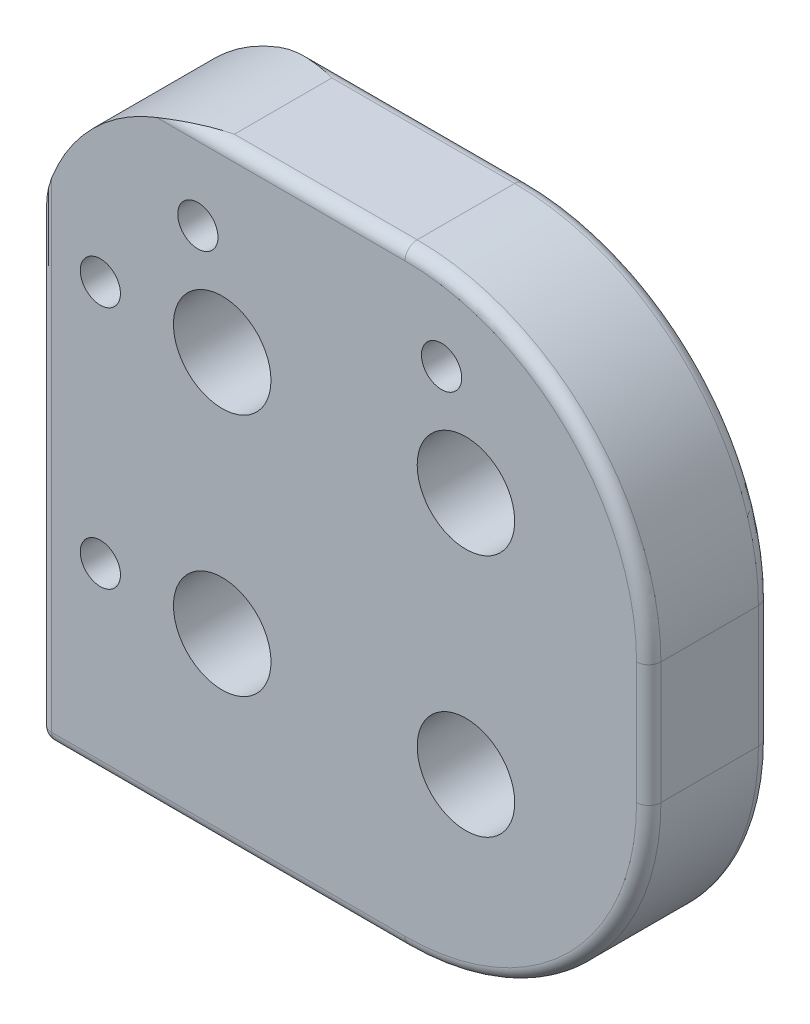
ISO-10303-21;
HEADER;
FILE_DESCRIPTION(('STEP AP214'),'2;1');
FILE_NAME('part.step','',(''),(''),'','','');
FILE_SCHEMA(('AUTOMOTIVE_DESIGN { 1 0 10303 214 1 1 1 1 }'));
ENDSEC;
DATA;
#1=APPLICATION_CONTEXT('core data for automotive mechanical design processes');
#2=APPLICATION_PROTOCOL_DEFINITION('international standard','automotive_design',2000,#1);
#3=PRODUCT_CONTEXT('',#1,'mechanical');
#4=PRODUCT('Part','Part','',(#3));
#5=PRODUCT_RELATED_PRODUCT_CATEGORY('part','',(#4));
#6=PRODUCT_DEFINITION_FORMATION('','',#4);
#7=PRODUCT_DEFINITION_CONTEXT('part definition',#1,'design');
#8=PRODUCT_DEFINITION('design','',#6,#7);
#9=PRODUCT_DEFINITION_SHAPE('','',#8);
#10=(LENGTH_UNIT() NAMED_UNIT(*) SI_UNIT(.MILLI.,.METRE.));
#11=(NAMED_UNIT(*) PLANE_ANGLE_UNIT() SI_UNIT($,.RADIAN.));
#12=(NAMED_UNIT(*) SI_UNIT($,.STERADIAN.) SOLID_ANGLE_UNIT());
#13=UNCERTAINTY_MEASURE_WITH_UNIT(LENGTH_MEASURE(1.E-05),#10,'distance_accuracy_value','');
#14=(GEOMETRIC_REPRESENTATION_CONTEXT(3) GLOBAL_UNCERTAINTY_ASSIGNED_CONTEXT((#13)) GLOBAL_UNIT_ASSIGNED_CONTEXT((#10,
#11,#12)) REPRESENTATION_CONTEXT('',''));
#15=CARTESIAN_POINT('',(0.,0.,0.));
#16=DIRECTION('',(0.,0.,1.));
#17=DIRECTION('',(1.,0.,0.));
#18=AXIS2_PLACEMENT_3D('',#15,#16,#17);
#19=CARTESIAN_POINT('',(-25.,25.,10.));
#20=DIRECTION('',(0.,-1.,0.));
#21=DIRECTION('',(0.,0.,-1.));
#22=AXIS2_PLACEMENT_3D('',#19,#20,#21);
#23=PLANE('',#22);
#24=DIRECTION('',(0.,0.,1.));
#25=VECTOR('',#24,1.);
#26=CARTESIAN_POINT('',(-9.9999999999999,25.,0.));
#27=LINE('',#26,#25);
#28=CARTESIAN_POINT('',(-9.9999999999999,25.,0.999999999999999));
#29=VERTEX_POINT('',#28);
#30=CARTESIAN_POINT('',(-9.9999999999999,25.,9.));
#31=VERTEX_POINT('',#30);
#32=EDGE_CURVE('E154',#29,#31,#27,.T.);
#33=ORIENTED_EDGE('',*,*,#32,.T.);
#34=DIRECTION('',(-1.,0.,0.));
#35=VECTOR('',#34,1.);
#36=CARTESIAN_POINT('',(-25.,25.,9.));
#37=LINE('',#36,#35);
#38=CARTESIAN_POINT('',(5.,25.,9.));
#39=VERTEX_POINT('',#38);
#40=EDGE_CURVE('E223',#31,#39,#37,.F.);
#41=ORIENTED_EDGE('',*,*,#40,.T.);
#42=DIRECTION('',(0.,0.,-1.));
#43=VECTOR('',#42,1.);
#44=CARTESIAN_POINT('',(5.,25.,10.));
#45=LINE('',#44,#43);
#46=CARTESIAN_POINT('',(5.,25.,0.999999999999999));
#47=VERTEX_POINT('',#46);
#48=EDGE_CURVE('E281',#39,#47,#45,.T.);
#49=ORIENTED_EDGE('',*,*,#48,.T.);
#50=DIRECTION('',(-1.,0.,0.));
#51=VECTOR('',#50,1.);
#52=CARTESIAN_POINT('',(-25.,25.,0.999999999999999));
#53=LINE('',#52,#51);
#54=EDGE_CURVE('E54',#47,#29,#53,.T.);
#55=ORIENTED_EDGE('',*,*,#54,.T.);
#56=EDGE_LOOP('',(#33,#41,#49,#55));
#57=FACE_BOUND('',#56,.T.);
#58=ADVANCED_FACE('F40',(#57),#23,.F.);
#59=CARTESIAN_POINT('',(0.,0.,10.));
#60=DIRECTION('',(0.,0.,-1.));
#61=DIRECTION('',(-1.,0.,0.));
#62=AXIS2_PLACEMENT_3D('',#59,#60,#61);
#63=PLANE('',#62);
#64=CARTESIAN_POINT('',(-20.,-10.,10.));
#65=DIRECTION('',(0.,0.,1.));
#66=DIRECTION('',(1.,0.,0.));
#67=AXIS2_PLACEMENT_3D('',#64,#65,#66);
#68=CIRCLE('',#67,1.65);
#69=CARTESIAN_POINT('',(-18.35,-10.,10.));
#70=VERTEX_POINT('',#69);
#71=EDGE_CURVE('E377',#70,#70,#68,.T.);
#72=ORIENTED_EDGE('',*,*,#71,.F.);
#73=EDGE_LOOP('',(#72));
#74=FACE_BOUND('',#73,.T.);
#75=CARTESIAN_POINT('',(-20.,10.,10.));
#76=DIRECTION('',(0.,0.,1.));
#77=DIRECTION('',(1.,0.,0.));
#78=AXIS2_PLACEMENT_3D('',#75,#76,#77);
#79=CIRCLE('',#78,1.65);
#80=CARTESIAN_POINT('',(-18.35,10.,10.));
#81=VERTEX_POINT('',#80);
#82=EDGE_CURVE('E380',#81,#81,#79,.T.);
#83=ORIENTED_EDGE('',*,*,#82,.F.);
#84=EDGE_LOOP('',(#83));
#85=FACE_BOUND('',#84,.T.);
#86=CARTESIAN_POINT('',(-12.,18.,10.));
#87=DIRECTION('',(0.,0.,1.));
#88=DIRECTION('',(1.,0.,0.));
#89=AXIS2_PLACEMENT_3D('',#86,#87,#88);
#90=CIRCLE('',#89,1.65);
#91=CARTESIAN_POINT('',(-10.35,18.,10.));
#92=VERTEX_POINT('',#91);
#93=EDGE_CURVE('E386',#92,#92,#90,.T.);
#94=ORIENTED_EDGE('',*,*,#93,.F.);
#95=EDGE_LOOP('',(#94));
#96=FACE_BOUND('',#95,.T.);
#97=CARTESIAN_POINT('',(8.,18.,10.));
#98=DIRECTION('',(0.,0.,1.));
#99=DIRECTION('',(1.,0.,0.));
#100=AXIS2_PLACEMENT_3D('',#97,#98,#99);
#101=CIRCLE('',#100,1.65);
#102=CARTESIAN_POINT('',(9.65,18.,10.));
#103=VERTEX_POINT('',#102);
#104=EDGE_CURVE('E392',#103,#103,#101,.T.);
#105=ORIENTED_EDGE('',*,*,#104,.F.);
#106=EDGE_LOOP('',(#105));
#107=FACE_BOUND('',#106,.T.);
#108=CARTESIAN_POINT('',(-10.,-10.,10.));
#109=DIRECTION('',(0.,0.,1.));
#110=DIRECTION('',(-1.,0.,0.));
#111=AXIS2_PLACEMENT_3D('',#108,#109,#110);
#112=CIRCLE('',#111,4.);
#113=CARTESIAN_POINT('',(-14.,-10.,10.));
#114=VERTEX_POINT('',#113);
#115=EDGE_CURVE('E409',#114,#114,#112,.T.);
#116=ORIENTED_EDGE('',*,*,#115,.F.);
#117=EDGE_LOOP('',(#116));
#118=FACE_BOUND('',#117,.T.);
#119=CARTESIAN_POINT('',(9.99999999999997,-10.,10.));
#120=DIRECTION('',(0.,0.,1.));
#121=DIRECTION('',(1.,0.,0.));
#122=AXIS2_PLACEMENT_3D('',#119,#120,#121);
#123=CIRCLE('',#122,4.);
#124=CARTESIAN_POINT('',(14.,-10.,10.));
#125=VERTEX_POINT('',#124);
#126=EDGE_CURVE('E403',#125,#125,#123,.T.);
#127=ORIENTED_EDGE('',*,*,#126,.F.);
#128=EDGE_LOOP('',(#127));
#129=FACE_BOUND('',#128,.T.);
#130=CARTESIAN_POINT('',(10.,10.,10.));
#131=DIRECTION('',(0.,0.,1.));
#132=DIRECTION('',(-1.,0.,0.));
#133=AXIS2_PLACEMENT_3D('',#130,#131,#132);
#134=CIRCLE('',#133,4.);
#135=CARTESIAN_POINT('',(6.,10.,10.));
#136=VERTEX_POINT('',#135);
#137=EDGE_CURVE('E397',#136,#136,#134,.T.);
#138=ORIENTED_EDGE('',*,*,#137,.F.);
#139=EDGE_LOOP('',(#138));
#140=FACE_BOUND('',#139,.T.);
#141=CARTESIAN_POINT('',(-10.,10.,10.));
#142=DIRECTION('',(0.,0.,1.));
#143=DIRECTION('',(1.,0.,0.));
#144=AXIS2_PLACEMENT_3D('',#141,#142,#143);
#145=CIRCLE('',#144,4.);
#146=CARTESIAN_POINT('',(-6.,10.,10.));
#147=VERTEX_POINT('',#146);
#148=EDGE_CURVE('E276',#147,#147,#145,.T.);
#149=ORIENTED_EDGE('',*,*,#148,.F.);
#150=EDGE_LOOP('',(#149));
#151=FACE_BOUND('',#150,.T.);
#152=DIRECTION('',(-1.,0.,0.));
#153=VECTOR('',#152,1.);
#154=CARTESIAN_POINT('',(0.,24.,10.));
#155=LINE('',#154,#153);
#156=CARTESIAN_POINT('',(5.,24.,10.));
#157=VERTEX_POINT('',#156);
#158=CARTESIAN_POINT('',(-15.3851648071345,24.,10.));
#159=VERTEX_POINT('',#158);
#160=EDGE_CURVE('E206',#157,#159,#155,.T.);
#161=ORIENTED_EDGE('',*,*,#160,.T.);
#162=CARTESIAN_POINT('',(-10.,10.,10.));
#163=DIRECTION('',(0.,0.,-1.));
#164=DIRECTION('',(1.,0.,0.));
#165=AXIS2_PLACEMENT_3D('',#162,#163,#164);
#166=CIRCLE('',#165,15.);
#167=CARTESIAN_POINT('',(-24.,15.3851648071345,10.));
#168=VERTEX_POINT('',#167);
#169=EDGE_CURVE('E170',#168,#159,#166,.T.);
#170=ORIENTED_EDGE('',*,*,#169,.F.);
#171=DIRECTION('',(0.,-1.,0.));
#172=VECTOR('',#171,1.);
#173=CARTESIAN_POINT('',(-24.,0.,10.));
#174=LINE('',#173,#172);
#175=CARTESIAN_POINT('',(-24.,-24.,10.));
#176=VERTEX_POINT('',#175);
#177=EDGE_CURVE('E204',#168,#176,#174,.T.);
#178=ORIENTED_EDGE('',*,*,#177,.T.);
#179=DIRECTION('',(1.,0.,0.));
#180=VECTOR('',#179,1.);
#181=CARTESIAN_POINT('',(0.,-24.,10.));
#182=LINE('',#181,#180);
#183=CARTESIAN_POINT('',(5.,-24.,10.));
#184=VERTEX_POINT('',#183);
#185=EDGE_CURVE('E215',#176,#184,#182,.T.);
#186=ORIENTED_EDGE('',*,*,#185,.T.);
#187=CARTESIAN_POINT('',(5.,-5.,10.));
#188=DIRECTION('',(0.,0.,-1.));
#189=DIRECTION('',(-1.,0.,0.));
#190=AXIS2_PLACEMENT_3D('',#187,#188,#189);
#191=CIRCLE('',#190,19.);
#192=CARTESIAN_POINT('',(24.,-5.,10.));
#193=VERTEX_POINT('',#192);
#194=EDGE_CURVE('E213',#184,#193,#191,.F.);
#195=ORIENTED_EDGE('',*,*,#194,.T.);
#196=DIRECTION('',(0.,1.,0.));
#197=VECTOR('',#196,1.);
#198=CARTESIAN_POINT('',(24.,0.,10.));
#199=LINE('',#198,#197);
#200=CARTESIAN_POINT('',(24.,5.,10.));
#201=VERTEX_POINT('',#200);
#202=EDGE_CURVE('E211',#193,#201,#199,.T.);
#203=ORIENTED_EDGE('',*,*,#202,.T.);
#204=CARTESIAN_POINT('',(5.,5.,10.));
#205=DIRECTION('',(0.,0.,-1.));
#206=DIRECTION('',(-1.,0.,0.));
#207=AXIS2_PLACEMENT_3D('',#204,#205,#206);
#208=CIRCLE('',#207,19.);
#209=EDGE_CURVE('E209',#201,#157,#208,.F.);
#210=ORIENTED_EDGE('',*,*,#209,.T.);
#211=EDGE_LOOP('',(#161,#170,#178,#186,#195,#203,#210));
#212=FACE_BOUND('',#211,.T.);
#213=ADVANCED_FACE('F323',(#74,#85,#96,#107,#118,#129,#140,#151,#212),#63,.F.);
#214=CARTESIAN_POINT('',(0.,0.,0.));
#215=DIRECTION('',(0.,0.,-1.));
#216=DIRECTION('',(-1.,0.,0.));
#217=AXIS2_PLACEMENT_3D('',#214,#215,#216);
#218=PLANE('',#217);
#219=CARTESIAN_POINT('',(-10.,10.,0.));
#220=DIRECTION('',(0.,0.,1.));
#221=DIRECTION('',(1.,0.,0.));
#222=AXIS2_PLACEMENT_3D('',#219,#220,#221);
#223=CIRCLE('',#222,4.);
#224=CARTESIAN_POINT('',(-6.,10.,0.));
#225=VERTEX_POINT('',#224);
#226=EDGE_CURVE('E229',#225,#225,#223,.T.);
#227=ORIENTED_EDGE('',*,*,#226,.T.);
#228=EDGE_LOOP('',(#227));
#229=FACE_BOUND('',#228,.T.);
#230=CARTESIAN_POINT('',(10.,10.,0.));
#231=DIRECTION('',(0.,0.,1.));
#232=DIRECTION('',(-1.,0.,0.));
#233=AXIS2_PLACEMENT_3D('',#230,#231,#232);
#234=CIRCLE('',#233,4.);
#235=CARTESIAN_POINT('',(6.,10.,0.));
#236=VERTEX_POINT('',#235);
#237=EDGE_CURVE('E400',#236,#236,#234,.T.);
#238=ORIENTED_EDGE('',*,*,#237,.T.);
#239=EDGE_LOOP('',(#238));
#240=FACE_BOUND('',#239,.T.);
#241=CARTESIAN_POINT('',(9.99999999999997,-10.,0.));
#242=DIRECTION('',(0.,0.,1.));
#243=DIRECTION('',(1.,0.,0.));
#244=AXIS2_PLACEMENT_3D('',#241,#242,#243);
#245=CIRCLE('',#244,4.);
#246=CARTESIAN_POINT('',(14.,-10.,0.));
#247=VERTEX_POINT('',#246);
#248=EDGE_CURVE('E406',#247,#247,#245,.T.);
#249=ORIENTED_EDGE('',*,*,#248,.T.);
#250=EDGE_LOOP('',(#249));
#251=FACE_BOUND('',#250,.T.);
#252=CARTESIAN_POINT('',(-10.,-10.,0.));
#253=DIRECTION('',(0.,0.,1.));
#254=DIRECTION('',(-1.,0.,0.));
#255=AXIS2_PLACEMENT_3D('',#252,#253,#254);
#256=CIRCLE('',#255,4.);
#257=CARTESIAN_POINT('',(-14.,-10.,0.));
#258=VERTEX_POINT('',#257);
#259=EDGE_CURVE('E376',#258,#258,#256,.T.);
#260=ORIENTED_EDGE('',*,*,#259,.T.);
#261=EDGE_LOOP('',(#260));
#262=FACE_BOUND('',#261,.T.);
#263=CARTESIAN_POINT('',(8.,18.,0.));
#264=DIRECTION('',(0.,0.,1.));
#265=DIRECTION('',(1.,0.,0.));
#266=AXIS2_PLACEMENT_3D('',#263,#264,#265);
#267=CIRCLE('',#266,1.65);
#268=CARTESIAN_POINT('',(9.65,18.,0.));
#269=VERTEX_POINT('',#268);
#270=EDGE_CURVE('E372',#269,#269,#267,.T.);
#271=ORIENTED_EDGE('',*,*,#270,.T.);
#272=EDGE_LOOP('',(#271));
#273=FACE_BOUND('',#272,.T.);
#274=CARTESIAN_POINT('',(-12.,18.,0.));
#275=DIRECTION('',(0.,0.,1.));
#276=DIRECTION('',(1.,0.,0.));
#277=AXIS2_PLACEMENT_3D('',#274,#275,#276);
#278=CIRCLE('',#277,1.65);
#279=CARTESIAN_POINT('',(-10.35,18.,0.));
#280=VERTEX_POINT('',#279);
#281=EDGE_CURVE('E389',#280,#280,#278,.T.);
#282=ORIENTED_EDGE('',*,*,#281,.T.);
#283=EDGE_LOOP('',(#282));
#284=FACE_BOUND('',#283,.T.);
#285=CARTESIAN_POINT('',(-20.,10.,0.));
#286=DIRECTION('',(0.,0.,1.));
#287=DIRECTION('',(1.,0.,0.));
#288=AXIS2_PLACEMENT_3D('',#285,#286,#287);
#289=CIRCLE('',#288,1.65);
#290=CARTESIAN_POINT('',(-18.35,10.,0.));
#291=VERTEX_POINT('',#290);
#292=EDGE_CURVE('E383',#291,#291,#289,.T.);
#293=ORIENTED_EDGE('',*,*,#292,.T.);
#294=EDGE_LOOP('',(#293));
#295=FACE_BOUND('',#294,.T.);
#296=CARTESIAN_POINT('',(-20.,-10.,0.));
#297=DIRECTION('',(0.,0.,1.));
#298=DIRECTION('',(1.,0.,0.));
#299=AXIS2_PLACEMENT_3D('',#296,#297,#298);
#300=CIRCLE('',#299,1.65);
#301=CARTESIAN_POINT('',(-18.35,-10.,0.));
#302=VERTEX_POINT('',#301);
#303=EDGE_CURVE('E373',#302,#302,#300,.T.);
#304=ORIENTED_EDGE('',*,*,#303,.T.);
#305=EDGE_LOOP('',(#304));
#306=FACE_BOUND('',#305,.T.);
#307=CARTESIAN_POINT('',(-10.,10.,0.));
#308=DIRECTION('',(0.,0.,-1.));
#309=DIRECTION('',(1.,0.,0.));
#310=AXIS2_PLACEMENT_3D('',#307,#308,#309);
#311=CIRCLE('',#310,15.);
#312=CARTESIAN_POINT('',(-24.,15.3851648071345,0.));
#313=VERTEX_POINT('',#312);
#314=CARTESIAN_POINT('',(-15.3851648071345,24.,0.));
#315=VERTEX_POINT('',#314);
#316=EDGE_CURVE('E60',#313,#315,#311,.T.);
#317=ORIENTED_EDGE('',*,*,#316,.T.);
#318=DIRECTION('',(-1.,0.,0.));
#319=VECTOR('',#318,1.);
#320=CARTESIAN_POINT('',(5.,24.,0.));
#321=LINE('',#320,#319);
#322=CARTESIAN_POINT('',(5.,24.,0.));
#323=VERTEX_POINT('',#322);
#324=EDGE_CURVE('E165',#315,#323,#321,.F.);
#325=ORIENTED_EDGE('',*,*,#324,.T.);
#326=CARTESIAN_POINT('',(5.,5.,0.));
#327=DIRECTION('',(0.,0.,-1.));
#328=DIRECTION('',(-1.,0.,0.));
#329=AXIS2_PLACEMENT_3D('',#326,#327,#328);
#330=CIRCLE('',#329,19.);
#331=CARTESIAN_POINT('',(24.,5.,0.));
#332=VERTEX_POINT('',#331);
#333=EDGE_CURVE('E178',#323,#332,#330,.T.);
#334=ORIENTED_EDGE('',*,*,#333,.T.);
#335=DIRECTION('',(0.,1.,0.));
#336=VECTOR('',#335,1.);
#337=CARTESIAN_POINT('',(24.,-5.,0.));
#338=LINE('',#337,#336);
#339=CARTESIAN_POINT('',(24.,-5.,0.));
#340=VERTEX_POINT('',#339);
#341=EDGE_CURVE('E186',#332,#340,#338,.F.);
#342=ORIENTED_EDGE('',*,*,#341,.T.);
#343=CARTESIAN_POINT('',(5.,-5.,0.));
#344=DIRECTION('',(0.,0.,-1.));
#345=DIRECTION('',(-1.,0.,0.));
#346=AXIS2_PLACEMENT_3D('',#343,#344,#345);
#347=CIRCLE('',#346,19.);
#348=CARTESIAN_POINT('',(5.,-24.,0.));
#349=VERTEX_POINT('',#348);
#350=EDGE_CURVE('E188',#340,#349,#347,.T.);
#351=ORIENTED_EDGE('',*,*,#350,.T.);
#352=DIRECTION('',(1.,0.,0.));
#353=VECTOR('',#352,1.);
#354=CARTESIAN_POINT('',(-25.,-24.,0.));
#355=LINE('',#354,#353);
#356=CARTESIAN_POINT('',(-24.,-24.,0.));
#357=VERTEX_POINT('',#356);
#358=EDGE_CURVE('E190',#349,#357,#355,.F.);
#359=ORIENTED_EDGE('',*,*,#358,.T.);
#360=DIRECTION('',(0.,-1.,0.));
#361=VECTOR('',#360,1.);
#362=CARTESIAN_POINT('',(-24.,25.,0.));
#363=LINE('',#362,#361);
#364=EDGE_CURVE('E169',#357,#313,#363,.F.);
#365=ORIENTED_EDGE('',*,*,#364,.T.);
#366=EDGE_LOOP('',(#317,#325,#334,#342,#351,#359,#365));
#367=FACE_BOUND('',#366,.T.);
#368=ADVANCED_FACE('F164',(#229,#240,#251,#262,#273,#284,#295,#306,#367),#218,.T.);
#369=CARTESIAN_POINT('',(25.,-25.,10.));
#370=DIRECTION('',(-1.,0.,0.));
#371=DIRECTION('',(0.,0.,1.));
#372=AXIS2_PLACEMENT_3D('',#369,#370,#371);
#373=PLANE('',#372);
#374=DIRECTION('',(0.,0.,-1.));
#375=VECTOR('',#374,1.);
#376=CARTESIAN_POINT('',(25.,-5.,10.));
#377=LINE('',#376,#375);
#378=CARTESIAN_POINT('',(25.,-5.,9.));
#379=VERTEX_POINT('',#378);
#380=CARTESIAN_POINT('',(25.,-5.,0.999999999999999));
#381=VERTEX_POINT('',#380);
#382=EDGE_CURVE('E267',#379,#381,#377,.T.);
#383=ORIENTED_EDGE('',*,*,#382,.T.);
#384=DIRECTION('',(0.,1.,0.));
#385=VECTOR('',#384,1.);
#386=CARTESIAN_POINT('',(25.,5.,0.999999999999999));
#387=LINE('',#386,#385);
#388=CARTESIAN_POINT('',(25.,5.,0.999999999999999));
#389=VERTEX_POINT('',#388);
#390=EDGE_CURVE('E198',#381,#389,#387,.T.);
#391=ORIENTED_EDGE('',*,*,#390,.T.);
#392=DIRECTION('',(0.,0.,-1.));
#393=VECTOR('',#392,1.);
#394=CARTESIAN_POINT('',(25.,5.,10.));
#395=LINE('',#394,#393);
#396=CARTESIAN_POINT('',(25.,5.,9.));
#397=VERTEX_POINT('',#396);
#398=EDGE_CURVE('E261',#389,#397,#395,.F.);
#399=ORIENTED_EDGE('',*,*,#398,.T.);
#400=DIRECTION('',(0.,1.,0.));
#401=VECTOR('',#400,1.);
#402=CARTESIAN_POINT('',(25.,-25.,9.));
#403=LINE('',#402,#401);
#404=EDGE_CURVE('E196',#397,#379,#403,.F.);
#405=ORIENTED_EDGE('',*,*,#404,.T.);
#406=EDGE_LOOP('',(#383,#391,#399,#405));
#407=FACE_BOUND('',#406,.T.);
#408=ADVANCED_FACE('F428',(#407),#373,.F.);
#409=CARTESIAN_POINT('',(-25.,-25.,10.));
#410=DIRECTION('',(1.,0.,0.));
#411=DIRECTION('',(0.,0.,-1.));
#412=AXIS2_PLACEMENT_3D('',#409,#410,#411);
#413=PLANE('',#412);
#414=DIRECTION('',(0.,-1.,0.));
#415=VECTOR('',#414,1.);
#416=CARTESIAN_POINT('',(-25.,-25.,9.));
#417=LINE('',#416,#415);
#418=CARTESIAN_POINT('',(-25.,-24.,9.));
#419=VERTEX_POINT('',#418);
#420=CARTESIAN_POINT('',(-25.,9.9999999999999,9.));
#421=VERTEX_POINT('',#420);
#422=EDGE_CURVE('E218',#419,#421,#417,.F.);
#423=ORIENTED_EDGE('',*,*,#422,.T.);
#424=DIRECTION('',(0.,0.,1.));
#425=VECTOR('',#424,1.);
#426=CARTESIAN_POINT('',(-25.,9.9999999999999,0.));
#427=LINE('',#426,#425);
#428=CARTESIAN_POINT('',(-25.,9.9999999999999,0.999999999999999));
#429=VERTEX_POINT('',#428);
#430=EDGE_CURVE('E160',#429,#421,#427,.T.);
#431=ORIENTED_EDGE('',*,*,#430,.F.);
#432=DIRECTION('',(0.,-1.,0.));
#433=VECTOR('',#432,1.);
#434=CARTESIAN_POINT('',(-25.,-25.,0.999999999999999));
#435=LINE('',#434,#433);
#436=CARTESIAN_POINT('',(-25.,-24.,0.999999999999999));
#437=VERTEX_POINT('',#436);
#438=EDGE_CURVE('E68',#429,#437,#435,.T.);
#439=ORIENTED_EDGE('',*,*,#438,.T.);
#440=DIRECTION('',(0.,0.,-1.));
#441=VECTOR('',#440,1.);
#442=CARTESIAN_POINT('',(-25.,-24.,10.));
#443=LINE('',#442,#441);
#444=EDGE_CURVE('E221',#437,#419,#443,.F.);
#445=ORIENTED_EDGE('',*,*,#444,.T.);
#446=EDGE_LOOP('',(#423,#431,#439,#445));
#447=FACE_BOUND('',#446,.T.);
#448=ADVANCED_FACE('F331',(#447),#413,.F.);
#449=CARTESIAN_POINT('',(-25.,-25.,10.));
#450=DIRECTION('',(0.,1.,0.));
#451=DIRECTION('',(0.,0.,1.));
#452=AXIS2_PLACEMENT_3D('',#449,#450,#451);
#453=PLANE('',#452);
#454=DIRECTION('',(0.,0.,-1.));
#455=VECTOR('',#454,1.);
#456=CARTESIAN_POINT('',(-24.,-25.,10.));
#457=LINE('',#456,#455);
#458=CARTESIAN_POINT('',(-24.,-25.,9.));
#459=VERTEX_POINT('',#458);
#460=CARTESIAN_POINT('',(-24.,-25.,0.999999999999999));
#461=VERTEX_POINT('',#460);
#462=EDGE_CURVE('E284',#459,#461,#457,.T.);
#463=ORIENTED_EDGE('',*,*,#462,.T.);
#464=DIRECTION('',(1.,0.,0.));
#465=VECTOR('',#464,1.);
#466=CARTESIAN_POINT('',(5.,-25.,0.999999999999999));
#467=LINE('',#466,#465);
#468=CARTESIAN_POINT('',(5.,-25.,0.999999999999999));
#469=VERTEX_POINT('',#468);
#470=EDGE_CURVE('E176',#461,#469,#467,.T.);
#471=ORIENTED_EDGE('',*,*,#470,.T.);
#472=DIRECTION('',(0.,0.,-1.));
#473=VECTOR('',#472,1.);
#474=CARTESIAN_POINT('',(5.,-25.,10.));
#475=LINE('',#474,#473);
#476=CARTESIAN_POINT('',(5.,-25.,9.));
#477=VERTEX_POINT('',#476);
#478=EDGE_CURVE('E273',#469,#477,#475,.F.);
#479=ORIENTED_EDGE('',*,*,#478,.T.);
#480=DIRECTION('',(1.,0.,0.));
#481=VECTOR('',#480,1.);
#482=CARTESIAN_POINT('',(-25.,-25.,9.));
#483=LINE('',#482,#481);
#484=EDGE_CURVE('E181',#477,#459,#483,.F.);
#485=ORIENTED_EDGE('',*,*,#484,.T.);
#486=EDGE_LOOP('',(#463,#471,#479,#485));
#487=FACE_BOUND('',#486,.T.);
#488=ADVANCED_FACE('F288',(#487),#453,.F.);
#489=CARTESIAN_POINT('',(5.,-5.,10.));
#490=DIRECTION('',(0.,0.,-1.));
#491=DIRECTION('',(-1.,0.,0.));
#492=AXIS2_PLACEMENT_3D('',#489,#490,#491);
#493=CYLINDRICAL_SURFACE('',#492,20.);
#494=ORIENTED_EDGE('',*,*,#478,.F.);
#495=CARTESIAN_POINT('',(5.,-5.,0.999999999999999));
#496=DIRECTION('',(0.,0.,-1.));
#497=DIRECTION('',(-1.,0.,0.));
#498=AXIS2_PLACEMENT_3D('',#495,#496,#497);
#499=CIRCLE('',#498,20.);
#500=EDGE_CURVE('E194',#469,#381,#499,.F.);
#501=ORIENTED_EDGE('',*,*,#500,.T.);
#502=ORIENTED_EDGE('',*,*,#382,.F.);
#503=CARTESIAN_POINT('',(5.,-5.,9.));
#504=DIRECTION('',(0.,0.,-1.));
#505=DIRECTION('',(-1.,0.,0.));
#506=AXIS2_PLACEMENT_3D('',#503,#504,#505);
#507=CIRCLE('',#506,20.);
#508=EDGE_CURVE('E192',#379,#477,#507,.T.);
#509=ORIENTED_EDGE('',*,*,#508,.T.);
#510=EDGE_LOOP('',(#494,#501,#502,#509));
#511=FACE_BOUND('',#510,.T.);
#512=ADVANCED_FACE('F314',(#511),#493,.T.);
#513=CARTESIAN_POINT('',(5.,5.,10.));
#514=DIRECTION('',(0.,0.,-1.));
#515=DIRECTION('',(-1.,0.,0.));
#516=AXIS2_PLACEMENT_3D('',#513,#514,#515);
#517=CYLINDRICAL_SURFACE('',#516,20.);
#518=ORIENTED_EDGE('',*,*,#398,.F.);
#519=CARTESIAN_POINT('',(5.,5.,0.999999999999999));
#520=DIRECTION('',(0.,0.,-1.));
#521=DIRECTION('',(-1.,0.,0.));
#522=AXIS2_PLACEMENT_3D('',#519,#520,#521);
#523=CIRCLE('',#522,20.);
#524=EDGE_CURVE('E202',#389,#47,#523,.F.);
#525=ORIENTED_EDGE('',*,*,#524,.T.);
#526=ORIENTED_EDGE('',*,*,#48,.F.);
#527=CARTESIAN_POINT('',(5.,5.,9.));
#528=DIRECTION('',(0.,0.,-1.));
#529=DIRECTION('',(-1.,0.,0.));
#530=AXIS2_PLACEMENT_3D('',#527,#528,#529);
#531=CIRCLE('',#530,20.);
#532=EDGE_CURVE('E200',#39,#397,#531,.T.);
#533=ORIENTED_EDGE('',*,*,#532,.T.);
#534=EDGE_LOOP('',(#518,#525,#526,#533));
#535=FACE_BOUND('',#534,.T.);
#536=ADVANCED_FACE('F445',(#535),#517,.T.);
#537=CARTESIAN_POINT('',(5.,5.,9.));
#538=DIRECTION('',(0.,0.,-1.));
#539=DIRECTION('',(-1.,0.,0.));
#540=AXIS2_PLACEMENT_3D('',#537,#538,#539);
#541=TOROIDAL_SURFACE('',#540,19.,1.);
#542=CARTESIAN_POINT('',(24.,5.,9.));
#543=DIRECTION('',(0.,-1.,0.));
#544=DIRECTION('',(0.,0.,-1.));
#545=AXIS2_PLACEMENT_3D('',#542,#543,#544);
#546=CIRCLE('',#545,1.);
#547=EDGE_CURVE('E257',#397,#201,#546,.T.);
#548=ORIENTED_EDGE('',*,*,#547,.F.);
#549=ORIENTED_EDGE('',*,*,#532,.F.);
#550=CARTESIAN_POINT('',(5.,24.,9.));
#551=DIRECTION('',(-1.,0.,0.));
#552=DIRECTION('',(0.,0.,1.));
#553=AXIS2_PLACEMENT_3D('',#550,#551,#552);
#554=CIRCLE('',#553,1.);
#555=EDGE_CURVE('E259',#157,#39,#554,.T.);
#556=ORIENTED_EDGE('',*,*,#555,.F.);
#557=ORIENTED_EDGE('',*,*,#209,.F.);
#558=EDGE_LOOP('',(#548,#549,#556,#557));
#559=FACE_BOUND('',#558,.T.);
#560=ADVANCED_FACE('F42',(#559),#541,.T.);
#561=CARTESIAN_POINT('',(0.,24.,9.));
#562=DIRECTION('',(-1.,0.,0.));
#563=DIRECTION('',(0.,0.,1.));
#564=AXIS2_PLACEMENT_3D('',#561,#562,#563);
#565=CYLINDRICAL_SURFACE('',#564,1.);
#566=CARTESIAN_POINT('',(-15.3851648071345,24.,10.));
#567=CARTESIAN_POINT('',(-15.3065422189825,24.0302430802318,9.99999177096745));
#568=CARTESIAN_POINT('',(-15.2276768866572,24.0598181119397,9.99862906596334));
#569=CARTESIAN_POINT('',(-15.0695439051183,24.11760625522,9.9934855373577));
#570=CARTESIAN_POINT('',(-14.9902763408182,24.1458196420226,9.98970520465314));
#571=CARTESIAN_POINT('',(-14.7521204782051,24.2283365110435,9.97518349972585));
#572=CARTESIAN_POINT('',(-14.5927070353457,24.2805828241023,9.96126012910934));
#573=CARTESIAN_POINT('',(-14.2732438090192,24.3794052377435,9.92670591362936));
#574=CARTESIAN_POINT('',(-14.113195969466,24.4259926132005,9.90608871709156));
#575=CARTESIAN_POINT('',(-13.7923320100308,24.513645037829,9.85943700721909));
#576=CARTESIAN_POINT('',(-13.6315156257445,24.5547080198089,9.8334004752361));
#577=CARTESIAN_POINT('',(-13.1851959033455,24.6608478538277,9.75523964570049));
#578=CARTESIAN_POINT('',(-12.8990866025697,24.7200516163468,9.69847109064909));
#579=CARTESIAN_POINT('',(-12.3258642821095,24.821442731461,9.57581112777124));
#580=CARTESIAN_POINT('',(-12.0387509838522,24.8636249079946,9.50991695312218));
#581=CARTESIAN_POINT('',(-11.1762617528269,24.965008650281,9.30370088613476));
#582=CARTESIAN_POINT('',(-10.5996368749405,24.9990708898523,9.15482547152845));
#583=CARTESIAN_POINT('',(-10.015811257713,24.9999937467765,9.00408242345646));
#584=CARTESIAN_POINT('',(-10.007905559357,24.9999999964638,9.0020411803908));
#585=CARTESIAN_POINT('',(-10.,25.,9.));
#586=B_SPLINE_CURVE_WITH_KNOTS('',3,(#566,#567,#568,#569,#570,#571,#572,#573,#574,#575,#576,
#577,#578,#579,#580,#581,#582,#583,#584,#585),.UNSPECIFIED.,.F.,.F.,(4,2,2,2,2,2,2,2,2,4),(0.,
0.252681034636756,0.5053107789156,1.01001851160234,1.51370356972859,2.01757658234548,
2.90965687276398,3.8020082301165,5.58640000629381,5.61089491089817),.UNSPECIFIED.);
#587=EDGE_CURVE('E366',#159,#31,#586,.T.);
#588=ORIENTED_EDGE('',*,*,#587,.F.);
#589=ORIENTED_EDGE('',*,*,#160,.F.);
#590=ORIENTED_EDGE('',*,*,#555,.T.);
#591=ORIENTED_EDGE('',*,*,#40,.F.);
#592=EDGE_LOOP('',(#588,#589,#590,#591));
#593=FACE_BOUND('',#592,.T.);
#594=ADVANCED_FACE('F362',(#593),#565,.T.);
#595=CARTESIAN_POINT('',(24.,0.,9.));
#596=DIRECTION('',(0.,1.,0.));
#597=DIRECTION('',(0.,0.,1.));
#598=AXIS2_PLACEMENT_3D('',#595,#596,#597);
#599=CYLINDRICAL_SURFACE('',#598,1.);
#600=ORIENTED_EDGE('',*,*,#547,.T.);
#601=ORIENTED_EDGE('',*,*,#202,.F.);
#602=CARTESIAN_POINT('',(24.,-5.,9.));
#603=DIRECTION('',(0.,-1.,0.));
#604=DIRECTION('',(0.,0.,-1.));
#605=AXIS2_PLACEMENT_3D('',#602,#603,#604);
#606=CIRCLE('',#605,1.);
#607=EDGE_CURVE('E254',#379,#193,#606,.T.);
#608=ORIENTED_EDGE('',*,*,#607,.F.);
#609=ORIENTED_EDGE('',*,*,#404,.F.);
#610=EDGE_LOOP('',(#600,#601,#608,#609));
#611=FACE_BOUND('',#610,.T.);
#612=ADVANCED_FACE('F360',(#611),#599,.T.);
#613=CARTESIAN_POINT('',(5.,-5.,9.));
#614=DIRECTION('',(0.,0.,-1.));
#615=DIRECTION('',(-1.,0.,0.));
#616=AXIS2_PLACEMENT_3D('',#613,#614,#615);
#617=TOROIDAL_SURFACE('',#616,19.,1.);
#618=ORIENTED_EDGE('',*,*,#607,.T.);
#619=ORIENTED_EDGE('',*,*,#194,.F.);
#620=CARTESIAN_POINT('',(5.,-24.,9.));
#621=DIRECTION('',(-1.,0.,0.));
#622=DIRECTION('',(0.,0.,1.));
#623=AXIS2_PLACEMENT_3D('',#620,#621,#622);
#624=CIRCLE('',#623,1.);
#625=EDGE_CURVE('E252',#477,#184,#624,.T.);
#626=ORIENTED_EDGE('',*,*,#625,.F.);
#627=ORIENTED_EDGE('',*,*,#508,.F.);
#628=EDGE_LOOP('',(#618,#619,#626,#627));
#629=FACE_BOUND('',#628,.T.);
#630=ADVANCED_FACE('F319',(#629),#617,.T.);
#631=CARTESIAN_POINT('',(-24.,0.,9.));
#632=DIRECTION('',(0.,-1.,0.));
#633=DIRECTION('',(0.,0.,-1.));
#634=AXIS2_PLACEMENT_3D('',#631,#632,#633);
#635=CYLINDRICAL_SURFACE('',#634,1.);
#636=CARTESIAN_POINT('',(-24.,15.3851648071345,10.));
#637=CARTESIAN_POINT('',(-24.0302430802318,15.3065422189825,9.99999177096745));
#638=CARTESIAN_POINT('',(-24.0598181119397,15.2276768866572,9.99862906596334));
#639=CARTESIAN_POINT('',(-24.11760625522,15.0695439051183,9.9934855373577));
#640=CARTESIAN_POINT('',(-24.1458196420226,14.9902763408182,9.98970520465314));
#641=CARTESIAN_POINT('',(-24.2283365110435,14.7521204782051,9.97518349972585));
#642=CARTESIAN_POINT('',(-24.2805828241023,14.5927070353457,9.96126012910934));
#643=CARTESIAN_POINT('',(-24.3794052377435,14.2732438090192,9.92670591362936));
#644=CARTESIAN_POINT('',(-24.4259926132005,14.113195969466,9.90608871709156));
#645=CARTESIAN_POINT('',(-24.513645037829,13.7923320100308,9.85943700721909));
#646=CARTESIAN_POINT('',(-24.5547080198089,13.6315156257445,9.8334004752361));
#647=CARTESIAN_POINT('',(-24.6608478538277,13.1851959033455,9.75523964570049));
#648=CARTESIAN_POINT('',(-24.7200516163468,12.8990866025697,9.69847109064909));
#649=CARTESIAN_POINT('',(-24.821442731461,12.3258642821095,9.57581112777124));
#650=CARTESIAN_POINT('',(-24.8636249079946,12.0387509838522,9.50991695312218));
#651=CARTESIAN_POINT('',(-24.965008650281,11.1762617528269,9.30370088613476));
#652=CARTESIAN_POINT('',(-24.9990708898523,10.5996368749405,9.15482547152845));
#653=CARTESIAN_POINT('',(-24.9999937467765,10.015811257713,9.00408242345646));
#654=CARTESIAN_POINT('',(-24.9999999964638,10.007905559357,9.0020411803908));
#655=CARTESIAN_POINT('',(-25.,10.,9.));
#656=B_SPLINE_CURVE_WITH_KNOTS('',3,(#636,#637,#638,#639,#640,#641,#642,#643,#644,#645,#646,
#647,#648,#649,#650,#651,#652,#653,#654,#655),.UNSPECIFIED.,.F.,.F.,(4,2,2,2,2,2,2,2,2,4),(0.,
0.252681034636756,0.5053107789156,1.01001851160234,1.51370356972859,2.01757658234548,
2.90965687276398,3.8020082301165,5.58640000629381,5.61089491089817),.UNSPECIFIED.);
#657=EDGE_CURVE('E159',#421,#168,#656,.F.);
#658=ORIENTED_EDGE('',*,*,#657,.F.);
#659=ORIENTED_EDGE('',*,*,#422,.F.);
#660=CARTESIAN_POINT('',(-24.,-24.,9.));
#661=DIRECTION('',(0.,-1.,0.));
#662=DIRECTION('',(0.,0.,-1.));
#663=AXIS2_PLACEMENT_3D('',#660,#661,#662);
#664=CIRCLE('',#663,1.);
#665=EDGE_CURVE('E249',#176,#419,#664,.T.);
#666=ORIENTED_EDGE('',*,*,#665,.F.);
#667=ORIENTED_EDGE('',*,*,#177,.F.);
#668=EDGE_LOOP('',(#658,#659,#666,#667));
#669=FACE_BOUND('',#668,.T.);
#670=ADVANCED_FACE('F328',(#669),#635,.T.);
#671=CARTESIAN_POINT('',(0.,-24.,9.));
#672=DIRECTION('',(1.,0.,0.));
#673=DIRECTION('',(0.,0.,-1.));
#674=AXIS2_PLACEMENT_3D('',#671,#672,#673);
#675=CYLINDRICAL_SURFACE('',#674,1.);
#676=ORIENTED_EDGE('',*,*,#625,.T.);
#677=ORIENTED_EDGE('',*,*,#185,.F.);
#678=CARTESIAN_POINT('',(-24.,-24.,9.));
#679=DIRECTION('',(-1.,0.,0.));
#680=DIRECTION('',(0.,0.,1.));
#681=AXIS2_PLACEMENT_3D('',#678,#679,#680);
#682=CIRCLE('',#681,1.);
#683=EDGE_CURVE('E246',#459,#176,#682,.T.);
#684=ORIENTED_EDGE('',*,*,#683,.F.);
#685=ORIENTED_EDGE('',*,*,#484,.F.);
#686=EDGE_LOOP('',(#676,#677,#684,#685));
#687=FACE_BOUND('',#686,.T.);
#688=ADVANCED_FACE('F296',(#687),#675,.T.);
#689=CARTESIAN_POINT('',(-25.,24.,0.999999999999999));
#690=DIRECTION('',(1.,0.,0.));
#691=DIRECTION('',(0.,0.,-1.));
#692=AXIS2_PLACEMENT_3D('',#689,#690,#691);
#693=CYLINDRICAL_SURFACE('',#692,1.);
#694=CARTESIAN_POINT('',(-15.3851648071345,24.,0.));
#695=CARTESIAN_POINT('',(-15.3065422189825,24.0302430802318,8.22903255125683E-06));
#696=CARTESIAN_POINT('',(-15.2276768866572,24.0598181119397,0.0013709340366542));
#697=CARTESIAN_POINT('',(-15.0695439051183,24.11760625522,0.00651446264229615));
#698=CARTESIAN_POINT('',(-14.9902763408183,24.1458196420226,0.0102947953468597));
#699=CARTESIAN_POINT('',(-14.7521204782051,24.2283365110435,0.0248165002741495));
#700=CARTESIAN_POINT('',(-14.5927070353457,24.2805828241023,0.0387398708906522));
#701=CARTESIAN_POINT('',(-14.2732438090192,24.3794052377435,0.0732940863706313));
#702=CARTESIAN_POINT('',(-14.113195969466,24.4259926132005,0.0939112829084382));
#703=CARTESIAN_POINT('',(-13.7923320100308,24.513645037829,0.140562992780913));
#704=CARTESIAN_POINT('',(-13.6315156257445,24.5547080198089,0.166599524763895));
#705=CARTESIAN_POINT('',(-13.1851959033455,24.6608478538277,0.244760354299508));
#706=CARTESIAN_POINT('',(-12.8990866025697,24.7200516163468,0.301528909350897));
#707=CARTESIAN_POINT('',(-12.3258642821095,24.821442731461,0.424188872228776));
#708=CARTESIAN_POINT('',(-12.0387509838522,24.8636249079946,0.49008304687788));
#709=CARTESIAN_POINT('',(-11.1762617528268,24.965008650281,0.69629911386513));
#710=CARTESIAN_POINT('',(-10.5996368749403,24.9990708898523,0.845174528470928));
#711=CARTESIAN_POINT('',(-10.015811257713,24.9999937467765,0.995917576543524));
#712=CARTESIAN_POINT('',(-10.007905559357,24.9999999964638,0.997958819609187));
#713=CARTESIAN_POINT('',(-10.,25.,0.999999999999999));
#714=B_SPLINE_CURVE_WITH_KNOTS('',3,(#694,#695,#696,#697,#698,#699,#700,#701,#702,#703,#704,
#705,#706,#707,#708,#709,#710,#711,#712,#713),.UNSPECIFIED.,.F.,.F.,(4,2,2,2,2,2,2,2,2,4),(0.,
0.252681034636745,0.50531077891558,1.01001851160231,1.51370356972858,2.01757658234548,
2.90965687276398,3.80200823011651,5.58640000629381,5.61089491089817),.UNSPECIFIED.);
#715=EDGE_CURVE('E151',#29,#315,#714,.F.);
#716=ORIENTED_EDGE('',*,*,#715,.F.);
#717=ORIENTED_EDGE('',*,*,#54,.F.);
#718=CARTESIAN_POINT('',(5.,24.,1.));
#719=DIRECTION('',(1.,0.,0.));
#720=DIRECTION('',(0.,0.,-1.));
#721=AXIS2_PLACEMENT_3D('',#718,#719,#720);
#722=CIRCLE('',#721,1.);
#723=EDGE_CURVE('E174',#323,#47,#722,.T.);
#724=ORIENTED_EDGE('',*,*,#723,.F.);
#725=ORIENTED_EDGE('',*,*,#324,.F.);
#726=EDGE_LOOP('',(#716,#717,#724,#725));
#727=FACE_BOUND('',#726,.T.);
#728=ADVANCED_FACE('F172',(#727),#693,.T.);
#729=CARTESIAN_POINT('',(-24.,-24.,9.));
#730=DIRECTION('',(0.,0.,1.));
#731=DIRECTION('',(1.,0.,0.));
#732=AXIS2_PLACEMENT_3D('',#729,#730,#731);
#733=SPHERICAL_SURFACE('',#732,1.);
#734=ORIENTED_EDGE('',*,*,#683,.T.);
#735=ORIENTED_EDGE('',*,*,#665,.T.);
#736=CARTESIAN_POINT('',(-24.,-24.,9.));
#737=DIRECTION('',(0.,0.,1.));
#738=DIRECTION('',(1.,0.,0.));
#739=AXIS2_PLACEMENT_3D('',#736,#737,#738);
#740=CIRCLE('',#739,1.);
#741=EDGE_CURVE('E242',#459,#419,#740,.F.);
#742=ORIENTED_EDGE('',*,*,#741,.F.);
#743=EDGE_LOOP('',(#734,#735,#742));
#744=FACE_BOUND('',#743,.T.);
#745=ADVANCED_FACE('F299',(#744),#733,.T.);
#746=CARTESIAN_POINT('',(5.,5.,0.999999999999999));
#747=DIRECTION('',(0.,0.,-1.));
#748=DIRECTION('',(-1.,0.,0.));
#749=AXIS2_PLACEMENT_3D('',#746,#747,#748);
#750=TOROIDAL_SURFACE('',#749,19.,1.);
#751=ORIENTED_EDGE('',*,*,#723,.T.);
#752=ORIENTED_EDGE('',*,*,#524,.F.);
#753=CARTESIAN_POINT('',(24.,5.,1.));
#754=DIRECTION('',(0.,-1.,0.));
#755=DIRECTION('',(0.,0.,-1.));
#756=AXIS2_PLACEMENT_3D('',#753,#754,#755);
#757=CIRCLE('',#756,1.);
#758=EDGE_CURVE('E239',#332,#389,#757,.T.);
#759=ORIENTED_EDGE('',*,*,#758,.F.);
#760=ORIENTED_EDGE('',*,*,#333,.F.);
#761=EDGE_LOOP('',(#751,#752,#759,#760));
#762=FACE_BOUND('',#761,.T.);
#763=ADVANCED_FACE('F465',(#762),#750,.T.);
#764=CARTESIAN_POINT('',(-24.,-25.,0.999999999999999));
#765=DIRECTION('',(0.,1.,0.));
#766=DIRECTION('',(0.,0.,1.));
#767=AXIS2_PLACEMENT_3D('',#764,#765,#766);
#768=CYLINDRICAL_SURFACE('',#767,1.);
#769=CARTESIAN_POINT('',(-24.,15.3851648071345,0.));
#770=CARTESIAN_POINT('',(-24.0302430802318,15.3065422189825,8.22903255161769E-06));
#771=CARTESIAN_POINT('',(-24.0598181119397,15.2276768866572,0.00137093403665473));
#772=CARTESIAN_POINT('',(-24.11760625522,15.0695439051183,0.00651446264229691));
#773=CARTESIAN_POINT('',(-24.1458196420226,14.9902763408182,0.0102947953468605));
#774=CARTESIAN_POINT('',(-24.2283365110435,14.7521204782051,0.0248165002741508));
#775=CARTESIAN_POINT('',(-24.2805828241023,14.5927070353457,0.0387398708906545));
#776=CARTESIAN_POINT('',(-24.3794052377435,14.2732438090192,0.0732940863706345));
#777=CARTESIAN_POINT('',(-24.4259926132005,14.113195969466,0.0939112829084412));
#778=CARTESIAN_POINT('',(-24.513645037829,13.7923320100308,0.140562992780914));
#779=CARTESIAN_POINT('',(-24.5547080198089,13.6315156257445,0.166599524763895));
#780=CARTESIAN_POINT('',(-24.6608478538277,13.1851959033455,0.24476035429951));
#781=CARTESIAN_POINT('',(-24.7200516163468,12.8990866025697,0.301528909350908));
#782=CARTESIAN_POINT('',(-24.821442731461,12.3258642821095,0.424188872228764));
#783=CARTESIAN_POINT('',(-24.8636249079946,12.0387509838522,0.490083046877834));
#784=CARTESIAN_POINT('',(-24.965008650281,11.1762617528269,0.696299113865213));
#785=CARTESIAN_POINT('',(-24.9990708898523,10.5996368749404,0.8451745284714));
#786=CARTESIAN_POINT('',(-24.9999937467765,10.015811257713,0.995917576543538));
#787=CARTESIAN_POINT('',(-24.9999999964638,10.007905559357,0.997958819609194));
#788=CARTESIAN_POINT('',(-25.,10.,0.999999999999999));
#789=B_SPLINE_CURVE_WITH_KNOTS('',3,(#769,#770,#771,#772,#773,#774,#775,#776,#777,#778,#779,
#780,#781,#782,#783,#784,#785,#786,#787,#788),.UNSPECIFIED.,.F.,.F.,(4,2,2,2,2,2,2,2,2,4),(0.,
0.252681034636753,0.505310778915592,1.01001851160233,1.51370356972859,2.01757658234548,
2.90965687276398,3.8020082301165,5.58640000629381,5.61089491089817),.UNSPECIFIED.);
#790=EDGE_CURVE('E11',#313,#429,#789,.T.);
#791=ORIENTED_EDGE('',*,*,#790,.F.);
#792=ORIENTED_EDGE('',*,*,#364,.F.);
#793=CARTESIAN_POINT('',(-24.,-24.,0.999999999999999));
#794=DIRECTION('',(0.,-1.,0.));
#795=DIRECTION('',(0.,0.,-1.));
#796=AXIS2_PLACEMENT_3D('',#793,#794,#795);
#797=CIRCLE('',#796,1.);
#798=EDGE_CURVE('E236',#437,#357,#797,.T.);
#799=ORIENTED_EDGE('',*,*,#798,.F.);
#800=ORIENTED_EDGE('',*,*,#438,.F.);
#801=EDGE_LOOP('',(#791,#792,#799,#800));
#802=FACE_BOUND('',#801,.T.);
#803=ADVANCED_FACE('F462',(#802),#768,.T.);
#804=CARTESIAN_POINT('',(-24.,-24.,10.));
#805=DIRECTION('',(0.,0.,-1.));
#806=DIRECTION('',(-1.,0.,0.));
#807=AXIS2_PLACEMENT_3D('',#804,#805,#806);
#808=CYLINDRICAL_SURFACE('',#807,1.);
#809=ORIENTED_EDGE('',*,*,#741,.T.);
#810=ORIENTED_EDGE('',*,*,#444,.F.);
#811=CARTESIAN_POINT('',(-24.,-24.,0.999999999999999));
#812=DIRECTION('',(0.,0.,-1.));
#813=DIRECTION('',(-1.,0.,0.));
#814=AXIS2_PLACEMENT_3D('',#811,#812,#813);
#815=CIRCLE('',#814,1.);
#816=EDGE_CURVE('E234',#461,#437,#815,.T.);
#817=ORIENTED_EDGE('',*,*,#816,.F.);
#818=ORIENTED_EDGE('',*,*,#462,.F.);
#819=EDGE_LOOP('',(#809,#810,#817,#818));
#820=FACE_BOUND('',#819,.T.);
#821=ADVANCED_FACE('F302',(#820),#808,.T.);
#822=CARTESIAN_POINT('',(24.,-25.,0.999999999999999));
#823=DIRECTION('',(0.,-1.,0.));
#824=DIRECTION('',(0.,0.,-1.));
#825=AXIS2_PLACEMENT_3D('',#822,#823,#824);
#826=CYLINDRICAL_SURFACE('',#825,1.);
#827=ORIENTED_EDGE('',*,*,#758,.T.);
#828=ORIENTED_EDGE('',*,*,#390,.F.);
#829=CARTESIAN_POINT('',(24.,-5.,1.));
#830=DIRECTION('',(0.,-1.,0.));
#831=DIRECTION('',(0.,0.,-1.));
#832=AXIS2_PLACEMENT_3D('',#829,#830,#831);
#833=CIRCLE('',#832,1.);
#834=EDGE_CURVE('E231',#340,#381,#833,.T.);
#835=ORIENTED_EDGE('',*,*,#834,.F.);
#836=ORIENTED_EDGE('',*,*,#341,.F.);
#837=EDGE_LOOP('',(#827,#828,#835,#836));
#838=FACE_BOUND('',#837,.T.);
#839=ADVANCED_FACE('F457',(#838),#826,.T.);
#840=CARTESIAN_POINT('',(-24.,-24.,1.));
#841=DIRECTION('',(-1.,0.,0.));
#842=DIRECTION('',(0.,0.,1.));
#843=AXIS2_PLACEMENT_3D('',#840,#841,#842);
#844=SPHERICAL_SURFACE('',#843,1.);
#845=ORIENTED_EDGE('',*,*,#816,.T.);
#846=ORIENTED_EDGE('',*,*,#798,.T.);
#847=CARTESIAN_POINT('',(-24.,-24.,1.));
#848=DIRECTION('',(-1.,0.,0.));
#849=DIRECTION('',(0.,0.,1.));
#850=AXIS2_PLACEMENT_3D('',#847,#848,#849);
#851=CIRCLE('',#850,1.);
#852=EDGE_CURVE('E228',#461,#357,#851,.F.);
#853=ORIENTED_EDGE('',*,*,#852,.F.);
#854=EDGE_LOOP('',(#845,#846,#853));
#855=FACE_BOUND('',#854,.T.);
#856=ADVANCED_FACE('F307',(#855),#844,.T.);
#857=CARTESIAN_POINT('',(5.,-5.,0.999999999999999));
#858=DIRECTION('',(0.,0.,-1.));
#859=DIRECTION('',(-1.,0.,0.));
#860=AXIS2_PLACEMENT_3D('',#857,#858,#859);
#861=TOROIDAL_SURFACE('',#860,19.,1.);
#862=ORIENTED_EDGE('',*,*,#834,.T.);
#863=ORIENTED_EDGE('',*,*,#500,.F.);
#864=CARTESIAN_POINT('',(5.,-24.,1.));
#865=DIRECTION('',(-1.,0.,0.));
#866=DIRECTION('',(0.,0.,1.));
#867=AXIS2_PLACEMENT_3D('',#864,#865,#866);
#868=CIRCLE('',#867,1.);
#869=EDGE_CURVE('E226',#349,#469,#868,.T.);
#870=ORIENTED_EDGE('',*,*,#869,.F.);
#871=ORIENTED_EDGE('',*,*,#350,.F.);
#872=EDGE_LOOP('',(#862,#863,#870,#871));
#873=FACE_BOUND('',#872,.T.);
#874=ADVANCED_FACE('F451',(#873),#861,.T.);
#875=CARTESIAN_POINT('',(-25.,-24.,0.999999999999999));
#876=DIRECTION('',(-1.,0.,0.));
#877=DIRECTION('',(0.,0.,1.));
#878=AXIS2_PLACEMENT_3D('',#875,#876,#877);
#879=CYLINDRICAL_SURFACE('',#878,1.);
#880=ORIENTED_EDGE('',*,*,#852,.T.);
#881=ORIENTED_EDGE('',*,*,#358,.F.);
#882=ORIENTED_EDGE('',*,*,#869,.T.);
#883=ORIENTED_EDGE('',*,*,#470,.F.);
#884=EDGE_LOOP('',(#880,#881,#882,#883));
#885=FACE_BOUND('',#884,.T.);
#886=ADVANCED_FACE('F310',(#885),#879,.T.);
#887=CARTESIAN_POINT('',(-10.,10.,0.));
#888=DIRECTION('',(0.,0.,1.));
#889=DIRECTION('',(1.,0.,0.));
#890=AXIS2_PLACEMENT_3D('',#887,#888,#889);
#891=CYLINDRICAL_SURFACE('',#890,4.);
#892=ORIENTED_EDGE('',*,*,#226,.F.);
#893=EDGE_LOOP('',(#892));
#894=FACE_BOUND('',#893,.T.);
#895=ORIENTED_EDGE('',*,*,#148,.T.);
#896=EDGE_LOOP('',(#895));
#897=FACE_BOUND('',#896,.T.);
#898=ADVANCED_FACE('F419',(#894,#897),#891,.F.);
#899=CARTESIAN_POINT('',(10.,10.,0.));
#900=DIRECTION('',(0.,0.,1.));
#901=DIRECTION('',(1.,0.,0.));
#902=AXIS2_PLACEMENT_3D('',#899,#900,#901);
#903=CYLINDRICAL_SURFACE('',#902,4.);
#904=ORIENTED_EDGE('',*,*,#237,.F.);
#905=EDGE_LOOP('',(#904));
#906=FACE_BOUND('',#905,.T.);
#907=ORIENTED_EDGE('',*,*,#137,.T.);
#908=EDGE_LOOP('',(#907));
#909=FACE_BOUND('',#908,.T.);
#910=ADVANCED_FACE('F566',(#906,#909),#903,.F.);
#911=CARTESIAN_POINT('',(9.99999999999997,-10.,0.));
#912=DIRECTION('',(0.,0.,1.));
#913=DIRECTION('',(1.,0.,0.));
#914=AXIS2_PLACEMENT_3D('',#911,#912,#913);
#915=CYLINDRICAL_SURFACE('',#914,4.);
#916=ORIENTED_EDGE('',*,*,#248,.F.);
#917=EDGE_LOOP('',(#916));
#918=FACE_BOUND('',#917,.T.);
#919=ORIENTED_EDGE('',*,*,#126,.T.);
#920=EDGE_LOOP('',(#919));
#921=FACE_BOUND('',#920,.T.);
#922=ADVANCED_FACE('F575',(#918,#921),#915,.F.);
#923=CARTESIAN_POINT('',(-10.,-10.,0.));
#924=DIRECTION('',(0.,0.,1.));
#925=DIRECTION('',(1.,0.,0.));
#926=AXIS2_PLACEMENT_3D('',#923,#924,#925);
#927=CYLINDRICAL_SURFACE('',#926,4.);
#928=ORIENTED_EDGE('',*,*,#259,.F.);
#929=EDGE_LOOP('',(#928));
#930=FACE_BOUND('',#929,.T.);
#931=ORIENTED_EDGE('',*,*,#115,.T.);
#932=EDGE_LOOP('',(#931));
#933=FACE_BOUND('',#932,.T.);
#934=ADVANCED_FACE('F585',(#930,#933),#927,.F.);
#935=CARTESIAN_POINT('',(8.,18.,0.));
#936=DIRECTION('',(0.,0.,1.));
#937=DIRECTION('',(1.,0.,0.));
#938=AXIS2_PLACEMENT_3D('',#935,#936,#937);
#939=CYLINDRICAL_SURFACE('',#938,1.65);
#940=ORIENTED_EDGE('',*,*,#270,.F.);
#941=EDGE_LOOP('',(#940));
#942=FACE_BOUND('',#941,.T.);
#943=ORIENTED_EDGE('',*,*,#104,.T.);
#944=EDGE_LOOP('',(#943));
#945=FACE_BOUND('',#944,.T.);
#946=ADVANCED_FACE('F595',(#942,#945),#939,.F.);
#947=CARTESIAN_POINT('',(-12.,18.,0.));
#948=DIRECTION('',(0.,0.,1.));
#949=DIRECTION('',(1.,0.,0.));
#950=AXIS2_PLACEMENT_3D('',#947,#948,#949);
#951=CYLINDRICAL_SURFACE('',#950,1.65);
#952=ORIENTED_EDGE('',*,*,#281,.F.);
#953=EDGE_LOOP('',(#952));
#954=FACE_BOUND('',#953,.T.);
#955=ORIENTED_EDGE('',*,*,#93,.T.);
#956=EDGE_LOOP('',(#955));
#957=FACE_BOUND('',#956,.T.);
#958=ADVANCED_FACE('F604',(#954,#957),#951,.F.);
#959=CARTESIAN_POINT('',(-20.,10.,0.));
#960=DIRECTION('',(0.,0.,1.));
#961=DIRECTION('',(1.,0.,0.));
#962=AXIS2_PLACEMENT_3D('',#959,#960,#961);
#963=CYLINDRICAL_SURFACE('',#962,1.65);
#964=ORIENTED_EDGE('',*,*,#292,.F.);
#965=EDGE_LOOP('',(#964));
#966=FACE_BOUND('',#965,.T.);
#967=ORIENTED_EDGE('',*,*,#82,.T.);
#968=EDGE_LOOP('',(#967));
#969=FACE_BOUND('',#968,.T.);
#970=ADVANCED_FACE('F614',(#966,#969),#963,.F.);
#971=CARTESIAN_POINT('',(-20.,-10.,0.));
#972=DIRECTION('',(0.,0.,1.));
#973=DIRECTION('',(1.,0.,0.));
#974=AXIS2_PLACEMENT_3D('',#971,#972,#973);
#975=CYLINDRICAL_SURFACE('',#974,1.65);
#976=ORIENTED_EDGE('',*,*,#303,.F.);
#977=EDGE_LOOP('',(#976));
#978=FACE_BOUND('',#977,.T.);
#979=ORIENTED_EDGE('',*,*,#71,.T.);
#980=EDGE_LOOP('',(#979));
#981=FACE_BOUND('',#980,.T.);
#982=ADVANCED_FACE('F624',(#978,#981),#975,.F.);
#983=CARTESIAN_POINT('',(-10.,10.,0.));
#984=DIRECTION('',(0.,0.,1.));
#985=DIRECTION('',(1.,0.,0.));
#986=AXIS2_PLACEMENT_3D('',#983,#984,#985);
#987=CYLINDRICAL_SURFACE('',#986,15.);
#988=ORIENTED_EDGE('',*,*,#587,.T.);
#989=ORIENTED_EDGE('',*,*,#32,.F.);
#990=ORIENTED_EDGE('',*,*,#715,.T.);
#991=ORIENTED_EDGE('',*,*,#316,.F.);
#992=ORIENTED_EDGE('',*,*,#790,.T.);
#993=ORIENTED_EDGE('',*,*,#430,.T.);
#994=ORIENTED_EDGE('',*,*,#657,.T.);
#995=ORIENTED_EDGE('',*,*,#169,.T.);
#996=EDGE_LOOP('',(#988,#989,#990,#991,#992,#993,#994,#995));
#997=FACE_BOUND('',#996,.T.);
#998=ADVANCED_FACE('F152',(#997),#987,.T.);
#999=CLOSED_SHELL('',(#58,#213,#368,#408,#448,#488,#512,#536,#560,#594,#612,#630,#670,#688,#728,
#745,#763,#803,#821,#839,#856,#874,#886,#898,#910,#922,#934,#946,#958,#970,#982,#998));
#1000=MANIFOLD_SOLID_BREP('B2',#999);
#1001=ADVANCED_BREP_SHAPE_REPRESENTATION('',(#18,#1000),#14);
#1002=SHAPE_DEFINITION_REPRESENTATION(#9,#1001);
ENDSEC;
END-ISO-10303-21;
